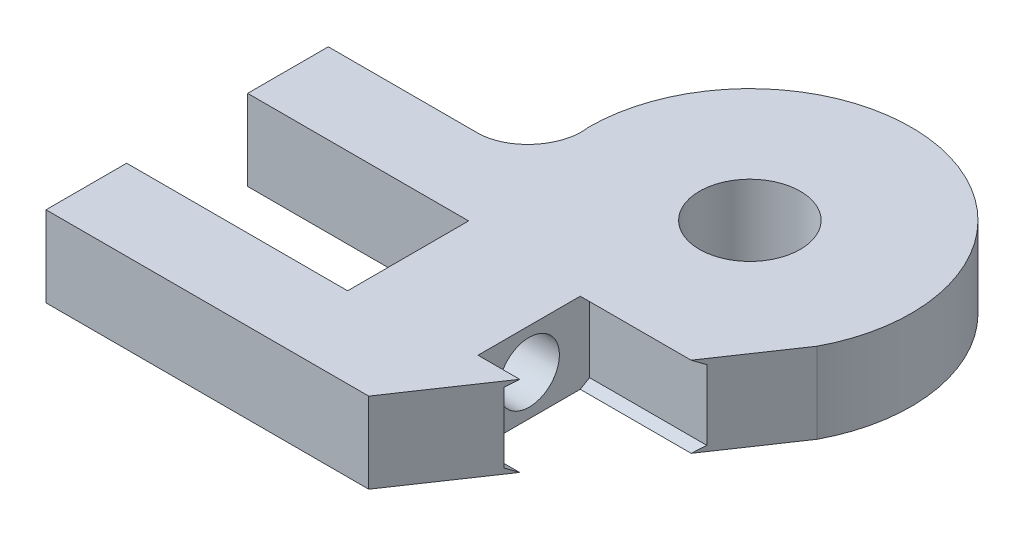
ISO-10303-21;
HEADER;
FILE_DESCRIPTION(('STEP AP214'),'2;1');
FILE_NAME('part.step','',(''),(''),'','','');
FILE_SCHEMA(('AUTOMOTIVE_DESIGN { 1 0 10303 214 1 1 1 1 }'));
ENDSEC;
DATA;
#1=APPLICATION_CONTEXT('core data for automotive mechanical design processes');
#2=APPLICATION_PROTOCOL_DEFINITION('international standard','automotive_design',2000,#1);
#3=PRODUCT_CONTEXT('',#1,'mechanical');
#4=PRODUCT('Part','Part','',(#3));
#5=PRODUCT_RELATED_PRODUCT_CATEGORY('part','',(#4));
#6=PRODUCT_DEFINITION_FORMATION('','',#4);
#7=PRODUCT_DEFINITION_CONTEXT('part definition',#1,'design');
#8=PRODUCT_DEFINITION('design','',#6,#7);
#9=PRODUCT_DEFINITION_SHAPE('','',#8);
#10=(LENGTH_UNIT() NAMED_UNIT(*) SI_UNIT(.MILLI.,.METRE.));
#11=(NAMED_UNIT(*) PLANE_ANGLE_UNIT() SI_UNIT($,.RADIAN.));
#12=(NAMED_UNIT(*) SI_UNIT($,.STERADIAN.) SOLID_ANGLE_UNIT());
#13=UNCERTAINTY_MEASURE_WITH_UNIT(LENGTH_MEASURE(1.E-05),#10,'distance_accuracy_value','');
#14=(GEOMETRIC_REPRESENTATION_CONTEXT(3) GLOBAL_UNCERTAINTY_ASSIGNED_CONTEXT((#13)) GLOBAL_UNIT_ASSIGNED_CONTEXT((#10,
#11,#12)) REPRESENTATION_CONTEXT('',''));
#15=CARTESIAN_POINT('',(0.,0.,0.));
#16=DIRECTION('',(0.,0.,1.));
#17=DIRECTION('',(1.,0.,0.));
#18=AXIS2_PLACEMENT_3D('',#15,#16,#17);
#19=CARTESIAN_POINT('',(7.09428135945336,4.,4.80069086107927));
#20=DIRECTION('',(-0.828195731701603,0.,-0.560438961878318));
#21=DIRECTION('',(-0.560438961878318,0.,0.828195731701603));
#22=AXIS2_PLACEMENT_3D('',#19,#20,#21);
#23=PLANE('',#22);
#24=DIRECTION('',(0.,1.,0.));
#25=VECTOR('',#24,1.);
#26=CARTESIAN_POINT('',(7.37140351893256,4.,4.39117010101042));
#27=LINE('',#26,#25);
#28=CARTESIAN_POINT('',(7.37140351893256,0.267949192431123,4.39117010101043));
#29=VERTEX_POINT('',#28);
#30=CARTESIAN_POINT('',(7.37140351893256,3.73205080756888,4.39117010101042));
#31=VERTEX_POINT('',#30);
#32=EDGE_CURVE('E11',#29,#31,#27,.T.);
#33=ORIENTED_EDGE('',*,*,#32,.T.);
#34=DIRECTION('',(0.505611207148687,0.431380721406754,-0.747173326882214));
#35=VECTOR('',#34,1.);
#36=CARTESIAN_POINT('',(7.20429348238066,3.58947475881277,4.63811906139843));
#37=LINE('',#36,#35);
#38=CARTESIAN_POINT('',(7.68546047121781,4.,3.92706848587267));
#39=VERTEX_POINT('',#38);
#40=EDGE_CURVE('E156',#31,#39,#37,.T.);
#41=ORIENTED_EDGE('',*,*,#40,.T.);
#42=DIRECTION('',(0.560438961878318,0.,-0.828195731701603));
#43=VECTOR('',#42,1.);
#44=CARTESIAN_POINT('',(7.09428135945336,4.,4.80069086107927));
#45=LINE('',#44,#43);
#46=CARTESIAN_POINT('',(4.6646087822495,4.,8.39117010101043));
#47=VERTEX_POINT('',#46);
#48=EDGE_CURVE('E135',#47,#39,#45,.T.);
#49=ORIENTED_EDGE('',*,*,#48,.F.);
#50=DIRECTION('',(0.,-1.,0.));
#51=VECTOR('',#50,1.);
#52=CARTESIAN_POINT('',(4.6646087822495,4.,8.39117010101043));
#53=LINE('',#52,#51);
#54=CARTESIAN_POINT('',(4.6646087822495,0.,8.39117010101043));
#55=VERTEX_POINT('',#54);
#56=EDGE_CURVE('E144',#47,#55,#53,.T.);
#57=ORIENTED_EDGE('',*,*,#56,.T.);
#58=DIRECTION('',(0.560438961878318,0.,-0.828195731701603));
#59=VECTOR('',#58,1.);
#60=CARTESIAN_POINT('',(7.09428135945336,0.,4.80069086107927));
#61=LINE('',#60,#59);
#62=CARTESIAN_POINT('',(7.68546047121781,0.,3.92706848587267));
#63=VERTEX_POINT('',#62);
#64=EDGE_CURVE('E188',#55,#63,#61,.T.);
#65=ORIENTED_EDGE('',*,*,#64,.T.);
#66=DIRECTION('',(-0.505611207148687,0.431380721406755,0.747173326882214));
#67=VECTOR('',#66,1.);
#68=CARTESIAN_POINT('',(6.3318497732161,1.15488254839288,5.92738373646376));
#69=LINE('',#68,#67);
#70=EDGE_CURVE('E282',#63,#29,#69,.T.);
#71=ORIENTED_EDGE('',*,*,#70,.T.);
#72=EDGE_LOOP('',(#33,#41,#49,#57,#65,#71));
#73=FACE_BOUND('',#72,.T.);
#74=ADVANCED_FACE('F37',(#73),#23,.F.);
#75=CARTESIAN_POINT('',(-3.91723550437462,4.,-5.60882989898957));
#76=CARTESIAN_POINT('',(-2.4076342223949,4.,-5.62724658271223));
#77=CARTESIAN_POINT('',(-1.19842789404271,4.,-7.12298520283082));
#78=CARTESIAN_POINT('',(-1.43410498266231,4.,-8.60882989898958));
#79=B_SPLINE_CURVE_WITH_KNOTS('',3,(#75,#76,#77,#78),.UNSPECIFIED.,.F.,.F.,(4,4),(0.,1.),.UNSPECIFIED.);
#80=DIRECTION('',(0.,-1.,0.));
#81=VECTOR('',#80,1.);
#82=SURFACE_OF_LINEAR_EXTRUSION('',#79,#81);
#83=CARTESIAN_POINT('',(-3.91723550437462,0.,-5.60882989898957));
#84=CARTESIAN_POINT('',(-2.4076342223949,0.,-5.62724658271223));
#85=CARTESIAN_POINT('',(-1.19842789404271,0.,-7.12298520283082));
#86=CARTESIAN_POINT('',(-1.43410498266231,0.,-8.60882989898958));
#87=B_SPLINE_CURVE_WITH_KNOTS('',3,(#83,#84,#85,#86),.UNSPECIFIED.,.F.,.F.,(4,4),(0.,1.),.UNSPECIFIED.);
#88=CARTESIAN_POINT('',(-3.91723550437462,0.,-5.60882989898957));
#89=VERTEX_POINT('',#88);
#90=CARTESIAN_POINT('',(-1.43410498266231,0.,-8.60882989898958));
#91=VERTEX_POINT('',#90);
#92=EDGE_CURVE('E164',#89,#91,#87,.T.);
#93=ORIENTED_EDGE('',*,*,#92,.F.);
#94=DIRECTION('',(0.,-1.,0.));
#95=VECTOR('',#94,1.);
#96=CARTESIAN_POINT('',(-3.91723550437462,4.,-5.60882989898957));
#97=LINE('',#96,#95);
#98=CARTESIAN_POINT('',(-3.91723550437462,4.,-5.60882989898957));
#99=VERTEX_POINT('',#98);
#100=EDGE_CURVE('E106',#99,#89,#97,.T.);
#101=ORIENTED_EDGE('',*,*,#100,.F.);
#102=CARTESIAN_POINT('',(-1.43410498266231,4.,-8.60882989898958));
#103=VERTEX_POINT('',#102);
#104=EDGE_CURVE('E195',#99,#103,#79,.T.);
#105=ORIENTED_EDGE('',*,*,#104,.T.);
#106=DIRECTION('',(0.,-1.,0.));
#107=VECTOR('',#106,1.);
#108=CARTESIAN_POINT('',(-1.43410498266231,4.,-8.60882989898958));
#109=LINE('',#108,#107);
#110=EDGE_CURVE('E101',#103,#91,#109,.T.);
#111=ORIENTED_EDGE('',*,*,#110,.T.);
#112=EDGE_LOOP('',(#93,#101,#105,#111));
#113=FACE_BOUND('',#112,.T.);
#114=ADVANCED_FACE('F39',(#113),#82,.T.);
#115=CARTESIAN_POINT('',(0.,4.,-5.60882989898957));
#116=DIRECTION('',(0.,0.,-1.));
#117=DIRECTION('',(-1.,0.,0.));
#118=AXIS2_PLACEMENT_3D('',#115,#116,#117);
#119=PLANE('',#118);
#120=DIRECTION('',(1.,0.,0.));
#121=VECTOR('',#120,1.);
#122=CARTESIAN_POINT('',(0.,0.,-5.60882989898957));
#123=LINE('',#122,#121);
#124=CARTESIAN_POINT('',(-11.3404612024368,0.,-5.60882989898957));
#125=VERTEX_POINT('',#124);
#126=EDGE_CURVE('E169',#125,#89,#123,.T.);
#127=ORIENTED_EDGE('',*,*,#126,.F.);
#128=DIRECTION('',(0.,-1.,0.));
#129=VECTOR('',#128,1.);
#130=CARTESIAN_POINT('',(-11.3404612024368,4.,-5.60882989898957));
#131=LINE('',#130,#129);
#132=CARTESIAN_POINT('',(-11.3404612024368,4.,-5.60882989898957));
#133=VERTEX_POINT('',#132);
#134=EDGE_CURVE('E212',#133,#125,#131,.T.);
#135=ORIENTED_EDGE('',*,*,#134,.F.);
#136=DIRECTION('',(1.,0.,0.));
#137=VECTOR('',#136,1.);
#138=CARTESIAN_POINT('',(0.,4.,-5.60882989898957));
#139=LINE('',#138,#137);
#140=EDGE_CURVE('E292',#133,#99,#139,.T.);
#141=ORIENTED_EDGE('',*,*,#140,.T.);
#142=ORIENTED_EDGE('',*,*,#100,.T.);
#143=EDGE_LOOP('',(#127,#135,#141,#142));
#144=FACE_BOUND('',#143,.T.);
#145=ADVANCED_FACE('F358',(#144),#119,.T.);
#146=CARTESIAN_POINT('',(-11.3404612024368,4.,0.));
#147=DIRECTION('',(1.,0.,0.));
#148=DIRECTION('',(0.,0.,-1.));
#149=AXIS2_PLACEMENT_3D('',#146,#147,#148);
#150=PLANE('',#149);
#151=DIRECTION('',(0.,0.,1.));
#152=VECTOR('',#151,1.);
#153=CARTESIAN_POINT('',(-11.3404612024368,0.,0.));
#154=LINE('',#153,#152);
#155=CARTESIAN_POINT('',(-11.3404612024368,0.,-1.60882989898957));
#156=VERTEX_POINT('',#155);
#157=EDGE_CURVE('E176',#125,#156,#154,.T.);
#158=ORIENTED_EDGE('',*,*,#157,.T.);
#159=DIRECTION('',(0.,-1.,0.));
#160=VECTOR('',#159,1.);
#161=CARTESIAN_POINT('',(-11.3404612024368,4.,-1.60882989898957));
#162=LINE('',#161,#160);
#163=CARTESIAN_POINT('',(-11.3404612024368,4.,-1.60882989898957));
#164=VERTEX_POINT('',#163);
#165=EDGE_CURVE('E209',#164,#156,#162,.T.);
#166=ORIENTED_EDGE('',*,*,#165,.F.);
#167=DIRECTION('',(0.,0.,1.));
#168=VECTOR('',#167,1.);
#169=CARTESIAN_POINT('',(-11.3404612024368,4.,0.));
#170=LINE('',#169,#168);
#171=EDGE_CURVE('E298',#133,#164,#170,.T.);
#172=ORIENTED_EDGE('',*,*,#171,.F.);
#173=ORIENTED_EDGE('',*,*,#134,.T.);
#174=EDGE_LOOP('',(#158,#166,#172,#173));
#175=FACE_BOUND('',#174,.T.);
#176=ADVANCED_FACE('F363',(#175),#150,.F.);
#177=CARTESIAN_POINT('',(0.,4.,-1.60882989898957));
#178=DIRECTION('',(0.,0.,-1.));
#179=DIRECTION('',(-1.,0.,0.));
#180=AXIS2_PLACEMENT_3D('',#177,#178,#179);
#181=PLANE('',#180);
#182=DIRECTION('',(1.,0.,0.));
#183=VECTOR('',#182,1.);
#184=CARTESIAN_POINT('',(0.,0.,-1.60882989898957));
#185=LINE('',#184,#183);
#186=CARTESIAN_POINT('',(-0.381690636444887,0.,-1.60882989898957));
#187=VERTEX_POINT('',#186);
#188=EDGE_CURVE('E178',#156,#187,#185,.T.);
#189=ORIENTED_EDGE('',*,*,#188,.T.);
#190=DIRECTION('',(0.,-1.,0.));
#191=VECTOR('',#190,1.);
#192=CARTESIAN_POINT('',(-0.381690636444887,4.,-1.60882989898957));
#193=LINE('',#192,#191);
#194=CARTESIAN_POINT('',(-0.381690636444887,4.,-1.60882989898957));
#195=VERTEX_POINT('',#194);
#196=EDGE_CURVE('E206',#195,#187,#193,.T.);
#197=ORIENTED_EDGE('',*,*,#196,.F.);
#198=DIRECTION('',(1.,0.,0.));
#199=VECTOR('',#198,1.);
#200=CARTESIAN_POINT('',(0.,4.,-1.60882989898957));
#201=LINE('',#200,#199);
#202=EDGE_CURVE('E300',#164,#195,#201,.T.);
#203=ORIENTED_EDGE('',*,*,#202,.F.);
#204=ORIENTED_EDGE('',*,*,#165,.T.);
#205=EDGE_LOOP('',(#189,#197,#203,#204));
#206=FACE_BOUND('',#205,.T.);
#207=ADVANCED_FACE('F367',(#206),#181,.F.);
#208=CARTESIAN_POINT('',(-0.381690636444887,4.,0.));
#209=DIRECTION('',(1.,0.,0.));
#210=DIRECTION('',(0.,0.,-1.));
#211=AXIS2_PLACEMENT_3D('',#208,#209,#210);
#212=PLANE('',#211);
#213=CARTESIAN_POINT('',(-0.381690636444887,2.,1.39117010101042));
#214=DIRECTION('',(1.,0.,0.));
#215=DIRECTION('',(0.,0.,-1.));
#216=AXIS2_PLACEMENT_3D('',#213,#214,#215);
#217=CIRCLE('',#216,1.5);
#218=CARTESIAN_POINT('',(-0.381690636444887,2.,-0.108829898989575));
#219=VERTEX_POINT('',#218);
#220=EDGE_CURVE('E170',#219,#219,#217,.T.);
#221=ORIENTED_EDGE('',*,*,#220,.T.);
#222=EDGE_LOOP('',(#221));
#223=FACE_BOUND('',#222,.T.);
#224=DIRECTION('',(0.,0.,1.));
#225=VECTOR('',#224,1.);
#226=CARTESIAN_POINT('',(-0.381690636444887,0.,0.));
#227=LINE('',#226,#225);
#228=CARTESIAN_POINT('',(-0.381690636444887,0.,4.39117010101043));
#229=VERTEX_POINT('',#228);
#230=EDGE_CURVE('E180',#187,#229,#227,.T.);
#231=ORIENTED_EDGE('',*,*,#230,.T.);
#232=DIRECTION('',(0.,-1.,0.));
#233=VECTOR('',#232,1.);
#234=CARTESIAN_POINT('',(-0.381690636444887,4.,4.39117010101043));
#235=LINE('',#234,#233);
#236=CARTESIAN_POINT('',(-0.381690636444887,4.,4.39117010101043));
#237=VERTEX_POINT('',#236);
#238=EDGE_CURVE('E203',#237,#229,#235,.T.);
#239=ORIENTED_EDGE('',*,*,#238,.F.);
#240=DIRECTION('',(0.,0.,1.));
#241=VECTOR('',#240,1.);
#242=CARTESIAN_POINT('',(-0.381690636444887,4.,0.));
#243=LINE('',#242,#241);
#244=EDGE_CURVE('E302',#195,#237,#243,.T.);
#245=ORIENTED_EDGE('',*,*,#244,.F.);
#246=ORIENTED_EDGE('',*,*,#196,.T.);
#247=EDGE_LOOP('',(#231,#239,#245,#246));
#248=FACE_BOUND('',#247,.T.);
#249=ADVANCED_FACE('F371',(#223,#248),#212,.F.);
#250=CARTESIAN_POINT('',(0.,4.,4.39117010101043));
#251=DIRECTION('',(0.,0.,1.));
#252=DIRECTION('',(1.,0.,0.));
#253=AXIS2_PLACEMENT_3D('',#250,#251,#252);
#254=PLANE('',#253);
#255=DIRECTION('',(-1.,0.,0.));
#256=VECTOR('',#255,1.);
#257=CARTESIAN_POINT('',(0.,0.,4.39117010101043));
#258=LINE('',#257,#256);
#259=CARTESIAN_POINT('',(-11.3404612024368,0.,4.39117010101043));
#260=VERTEX_POINT('',#259);
#261=EDGE_CURVE('E182',#229,#260,#258,.T.);
#262=ORIENTED_EDGE('',*,*,#261,.T.);
#263=DIRECTION('',(0.,-1.,0.));
#264=VECTOR('',#263,1.);
#265=CARTESIAN_POINT('',(-11.3404612024368,4.,4.39117010101043));
#266=LINE('',#265,#264);
#267=CARTESIAN_POINT('',(-11.3404612024368,4.,4.39117010101043));
#268=VERTEX_POINT('',#267);
#269=EDGE_CURVE('E200',#268,#260,#266,.T.);
#270=ORIENTED_EDGE('',*,*,#269,.F.);
#271=DIRECTION('',(-1.,0.,0.));
#272=VECTOR('',#271,1.);
#273=CARTESIAN_POINT('',(0.,4.,4.39117010101043));
#274=LINE('',#273,#272);
#275=EDGE_CURVE('E304',#237,#268,#274,.T.);
#276=ORIENTED_EDGE('',*,*,#275,.F.);
#277=ORIENTED_EDGE('',*,*,#238,.T.);
#278=EDGE_LOOP('',(#262,#270,#276,#277));
#279=FACE_BOUND('',#278,.T.);
#280=ADVANCED_FACE('F310',(#279),#254,.F.);
#281=CARTESIAN_POINT('',(-11.3404612024368,4.,0.));
#282=DIRECTION('',(1.,0.,0.));
#283=DIRECTION('',(0.,0.,-1.));
#284=AXIS2_PLACEMENT_3D('',#281,#282,#283);
#285=PLANE('',#284);
#286=DIRECTION('',(0.,0.,1.));
#287=VECTOR('',#286,1.);
#288=CARTESIAN_POINT('',(-11.3404612024368,0.,0.));
#289=LINE('',#288,#287);
#290=CARTESIAN_POINT('',(-11.3404612024368,0.,8.39117010101043));
#291=VERTEX_POINT('',#290);
#292=EDGE_CURVE('E184',#260,#291,#289,.T.);
#293=ORIENTED_EDGE('',*,*,#292,.T.);
#294=DIRECTION('',(0.,-1.,0.));
#295=VECTOR('',#294,1.);
#296=CARTESIAN_POINT('',(-11.3404612024368,4.,8.39117010101043));
#297=LINE('',#296,#295);
#298=CARTESIAN_POINT('',(-11.3404612024368,4.,8.39117010101043));
#299=VERTEX_POINT('',#298);
#300=EDGE_CURVE('E151',#299,#291,#297,.T.);
#301=ORIENTED_EDGE('',*,*,#300,.F.);
#302=DIRECTION('',(0.,0.,1.));
#303=VECTOR('',#302,1.);
#304=CARTESIAN_POINT('',(-11.3404612024368,4.,0.));
#305=LINE('',#304,#303);
#306=EDGE_CURVE('E137',#268,#299,#305,.T.);
#307=ORIENTED_EDGE('',*,*,#306,.F.);
#308=ORIENTED_EDGE('',*,*,#269,.T.);
#309=EDGE_LOOP('',(#293,#301,#307,#308));
#310=FACE_BOUND('',#309,.T.);
#311=ADVANCED_FACE('F314',(#310),#285,.F.);
#312=CARTESIAN_POINT('',(0.,4.,8.39117010101043));
#313=DIRECTION('',(0.,0.,-1.));
#314=DIRECTION('',(-1.,0.,0.));
#315=AXIS2_PLACEMENT_3D('',#312,#313,#314);
#316=PLANE('',#315);
#317=DIRECTION('',(1.,0.,0.));
#318=VECTOR('',#317,1.);
#319=CARTESIAN_POINT('',(0.,0.,8.39117010101043));
#320=LINE('',#319,#318);
#321=EDGE_CURVE('E147',#291,#55,#320,.T.);
#322=ORIENTED_EDGE('',*,*,#321,.T.);
#323=ORIENTED_EDGE('',*,*,#56,.F.);
#324=DIRECTION('',(1.,0.,0.));
#325=VECTOR('',#324,1.);
#326=CARTESIAN_POINT('',(0.,4.,8.39117010101043));
#327=LINE('',#326,#325);
#328=EDGE_CURVE('E129',#299,#47,#327,.T.);
#329=ORIENTED_EDGE('',*,*,#328,.F.);
#330=ORIENTED_EDGE('',*,*,#300,.T.);
#331=EDGE_LOOP('',(#322,#323,#329,#330));
#332=FACE_BOUND('',#331,.T.);
#333=ADVANCED_FACE('F145',(#332),#316,.F.);
#334=DIRECTION('',(0.,-1.,0.));
#335=VECTOR('',#334,1.);
#336=CARTESIAN_POINT('',(11.4315956239572,4.,-1.60882989898958));
#337=LINE('',#336,#335);
#338=CARTESIAN_POINT('',(11.4315956239572,3.73205080756887,-1.60882989898958));
#339=VERTEX_POINT('',#338);
#340=CARTESIAN_POINT('',(11.4315956239572,0.267949192431123,-1.60882989898958));
#341=VERTEX_POINT('',#340);
#342=EDGE_CURVE('E46',#339,#341,#337,.T.);
#343=ORIENTED_EDGE('',*,*,#342,.T.);
#344=DIRECTION('',(-0.505611207148687,-0.431380721406755,0.747173326882214));
#345=VECTOR('',#344,1.);
#346=CARTESIAN_POINT('',(8.71541031339753,-2.04946379639741,2.40504713978148));
#347=LINE('',#346,#345);
#348=CARTESIAN_POINT('',(11.1175386716719,0.,-1.14472828385182));
#349=VERTEX_POINT('',#348);
#350=EDGE_CURVE('E240',#341,#349,#347,.T.);
#351=ORIENTED_EDGE('',*,*,#350,.T.);
#352=CARTESIAN_POINT('',(13.6385765447403,0.,-4.87022374001289));
#353=VERTEX_POINT('',#352);
#354=EDGE_CURVE('E187',#349,#353,#61,.T.);
#355=ORIENTED_EDGE('',*,*,#354,.T.);
#356=DIRECTION('',(0.,-1.,0.));
#357=VECTOR('',#356,1.);
#358=CARTESIAN_POINT('',(13.6385765447403,4.,-4.87022374001289));
#359=LINE('',#358,#357);
#360=CARTESIAN_POINT('',(13.6385765447403,4.,-4.87022374001289));
#361=VERTEX_POINT('',#360);
#362=EDGE_CURVE('E152',#361,#353,#359,.T.);
#363=ORIENTED_EDGE('',*,*,#362,.F.);
#364=CARTESIAN_POINT('',(11.1175386716719,4.,-1.14472828385182));
#365=VERTEX_POINT('',#364);
#366=EDGE_CURVE('E141',#365,#361,#45,.T.);
#367=ORIENTED_EDGE('',*,*,#366,.F.);
#368=DIRECTION('',(0.505611207148687,-0.431380721406754,-0.747173326882214));
#369=VECTOR('',#368,1.);
#370=CARTESIAN_POINT('',(7.84296660423297,6.79382110360305,3.69431181484682));
#371=LINE('',#370,#369);
#372=EDGE_CURVE('E245',#365,#339,#371,.T.);
#373=ORIENTED_EDGE('',*,*,#372,.T.);
#374=EDGE_LOOP('',(#343,#351,#355,#363,#367,#373));
#375=FACE_BOUND('',#374,.T.);
#376=ADVANCED_FACE('F237',(#375),#23,.F.);
#377=CARTESIAN_POINT('',(6.56589501733769,4.,-8.60882989898958));
#378=DIRECTION('',(0.,-1.,0.));
#379=DIRECTION('',(0.,0.,-1.));
#380=AXIS2_PLACEMENT_3D('',#377,#378,#379);
#381=CYLINDRICAL_SURFACE('',#380,8.);
#382=CARTESIAN_POINT('',(6.56589501733769,0.,-8.60882989898958));
#383=DIRECTION('',(0.,1.,0.));
#384=DIRECTION('',(0.,0.,1.));
#385=AXIS2_PLACEMENT_3D('',#382,#383,#384);
#386=CIRCLE('',#385,8.);
#387=EDGE_CURVE('E190',#353,#91,#386,.T.);
#388=ORIENTED_EDGE('',*,*,#387,.T.);
#389=ORIENTED_EDGE('',*,*,#110,.F.);
#390=CARTESIAN_POINT('',(6.56589501733769,4.,-8.60882989898958));
#391=DIRECTION('',(0.,1.,0.));
#392=DIRECTION('',(0.,0.,1.));
#393=AXIS2_PLACEMENT_3D('',#390,#391,#392);
#394=CIRCLE('',#393,8.);
#395=EDGE_CURVE('E62',#361,#103,#394,.T.);
#396=ORIENTED_EDGE('',*,*,#395,.F.);
#397=ORIENTED_EDGE('',*,*,#362,.T.);
#398=EDGE_LOOP('',(#388,#389,#396,#397));
#399=FACE_BOUND('',#398,.T.);
#400=ADVANCED_FACE('F354',(#399),#381,.T.);
#401=CARTESIAN_POINT('',(6.56589501733769,4.,-8.60882989898958));
#402=DIRECTION('',(0.,-1.,0.));
#403=DIRECTION('',(0.,0.,-1.));
#404=AXIS2_PLACEMENT_3D('',#401,#402,#403);
#405=CYLINDRICAL_SURFACE('',#404,2.5);
#406=CARTESIAN_POINT('',(6.56589501733769,4.,-8.60882989898958));
#407=DIRECTION('',(0.,1.,0.));
#408=DIRECTION('',(0.,0.,1.));
#409=AXIS2_PLACEMENT_3D('',#406,#407,#408);
#410=CIRCLE('',#409,2.5);
#411=CARTESIAN_POINT('',(6.56589501733769,4.,-6.10882989898957));
#412=VERTEX_POINT('',#411);
#413=EDGE_CURVE('E158',#412,#412,#410,.T.);
#414=ORIENTED_EDGE('',*,*,#413,.T.);
#415=EDGE_LOOP('',(#414));
#416=FACE_BOUND('',#415,.T.);
#417=CARTESIAN_POINT('',(6.56589501733769,0.,-8.60882989898958));
#418=DIRECTION('',(0.,1.,0.));
#419=DIRECTION('',(0.,0.,1.));
#420=AXIS2_PLACEMENT_3D('',#417,#418,#419);
#421=CIRCLE('',#420,2.5);
#422=CARTESIAN_POINT('',(6.56589501733769,0.,-6.10882989898957));
#423=VERTEX_POINT('',#422);
#424=EDGE_CURVE('E192',#423,#423,#421,.T.);
#425=ORIENTED_EDGE('',*,*,#424,.F.);
#426=EDGE_LOOP('',(#425));
#427=FACE_BOUND('',#426,.T.);
#428=ADVANCED_FACE('F393',(#416,#427),#405,.F.);
#429=CARTESIAN_POINT('',(0.,4.,0.));
#430=DIRECTION('',(0.,1.,0.));
#431=DIRECTION('',(0.,0.,1.));
#432=AXIS2_PLACEMENT_3D('',#429,#430,#431);
#433=PLANE('',#432);
#434=DIRECTION('',(1.,0.,0.));
#435=VECTOR('',#434,1.);
#436=CARTESIAN_POINT('',(0.,4.,3.92706848587267));
#437=LINE('',#436,#435);
#438=CARTESIAN_POINT('',(5.61830936355511,4.,3.92706848587267));
#439=VERTEX_POINT('',#438);
#440=EDGE_CURVE('E229',#439,#39,#437,.T.);
#441=ORIENTED_EDGE('',*,*,#440,.F.);
#442=DIRECTION('',(0.,0.,1.));
#443=VECTOR('',#442,1.);
#444=CARTESIAN_POINT('',(5.61830936355511,4.,0.));
#445=LINE('',#444,#443);
#446=CARTESIAN_POINT('',(5.61830936355511,4.,-1.14472828385182));
#447=VERTEX_POINT('',#446);
#448=EDGE_CURVE('E278',#447,#439,#445,.T.);
#449=ORIENTED_EDGE('',*,*,#448,.F.);
#450=DIRECTION('',(-1.,0.,0.));
#451=VECTOR('',#450,1.);
#452=CARTESIAN_POINT('',(0.,4.,-1.14472828385182));
#453=LINE('',#452,#451);
#454=EDGE_CURVE('E226',#365,#447,#453,.T.);
#455=ORIENTED_EDGE('',*,*,#454,.F.);
#456=ORIENTED_EDGE('',*,*,#366,.T.);
#457=ORIENTED_EDGE('',*,*,#395,.T.);
#458=ORIENTED_EDGE('',*,*,#104,.F.);
#459=ORIENTED_EDGE('',*,*,#140,.F.);
#460=ORIENTED_EDGE('',*,*,#171,.T.);
#461=ORIENTED_EDGE('',*,*,#202,.T.);
#462=ORIENTED_EDGE('',*,*,#244,.T.);
#463=ORIENTED_EDGE('',*,*,#275,.T.);
#464=ORIENTED_EDGE('',*,*,#306,.T.);
#465=ORIENTED_EDGE('',*,*,#328,.T.);
#466=ORIENTED_EDGE('',*,*,#48,.T.);
#467=EDGE_LOOP('',(#441,#449,#455,#456,#457,#458,#459,#460,#461,#462,#463,#464,#465,#466));
#468=FACE_BOUND('',#467,.T.);
#469=ORIENTED_EDGE('',*,*,#413,.F.);
#470=EDGE_LOOP('',(#469));
#471=FACE_BOUND('',#470,.T.);
#472=ADVANCED_FACE('F132',(#468,#471),#433,.T.);
#473=CARTESIAN_POINT('',(0.,0.,0.));
#474=DIRECTION('',(0.,1.,0.));
#475=DIRECTION('',(0.,0.,1.));
#476=AXIS2_PLACEMENT_3D('',#473,#474,#475);
#477=PLANE('',#476);
#478=DIRECTION('',(0.,0.,1.));
#479=VECTOR('',#478,1.);
#480=CARTESIAN_POINT('',(5.61830936355511,0.,0.));
#481=LINE('',#480,#479);
#482=CARTESIAN_POINT('',(5.61830936355511,0.,-1.14472828385182));
#483=VERTEX_POINT('',#482);
#484=CARTESIAN_POINT('',(5.61830936355511,0.,3.92706848587267));
#485=VERTEX_POINT('',#484);
#486=EDGE_CURVE('E219',#483,#485,#481,.T.);
#487=ORIENTED_EDGE('',*,*,#486,.T.);
#488=DIRECTION('',(1.,0.,0.));
#489=VECTOR('',#488,1.);
#490=CARTESIAN_POINT('',(0.,0.,3.92706848587267));
#491=LINE('',#490,#489);
#492=EDGE_CURVE('E223',#485,#63,#491,.T.);
#493=ORIENTED_EDGE('',*,*,#492,.T.);
#494=ORIENTED_EDGE('',*,*,#64,.F.);
#495=ORIENTED_EDGE('',*,*,#321,.F.);
#496=ORIENTED_EDGE('',*,*,#292,.F.);
#497=ORIENTED_EDGE('',*,*,#261,.F.);
#498=ORIENTED_EDGE('',*,*,#230,.F.);
#499=ORIENTED_EDGE('',*,*,#188,.F.);
#500=ORIENTED_EDGE('',*,*,#157,.F.);
#501=ORIENTED_EDGE('',*,*,#126,.T.);
#502=ORIENTED_EDGE('',*,*,#92,.T.);
#503=ORIENTED_EDGE('',*,*,#387,.F.);
#504=ORIENTED_EDGE('',*,*,#354,.F.);
#505=DIRECTION('',(-1.,0.,0.));
#506=VECTOR('',#505,1.);
#507=CARTESIAN_POINT('',(0.,0.,-1.14472828385182));
#508=LINE('',#507,#506);
#509=EDGE_CURVE('E215',#349,#483,#508,.T.);
#510=ORIENTED_EDGE('',*,*,#509,.T.);
#511=EDGE_LOOP('',(#487,#493,#494,#495,#496,#497,#498,#499,#500,#501,#502,#503,#504,#510));
#512=FACE_BOUND('',#511,.T.);
#513=ORIENTED_EDGE('',*,*,#424,.T.);
#514=EDGE_LOOP('',(#513));
#515=FACE_BOUND('',#514,.T.);
#516=ADVANCED_FACE('F316',(#512,#515),#477,.F.);
#517=CARTESIAN_POINT('',(14.5658950173377,2.,1.39117010101042));
#518=DIRECTION('',(-1.,0.,0.));
#519=DIRECTION('',(0.,0.,1.));
#520=AXIS2_PLACEMENT_3D('',#517,#518,#519);
#521=CYLINDRICAL_SURFACE('',#520,1.5);
#522=CARTESIAN_POINT('',(5.61830936355511,2.,1.39117010101042));
#523=DIRECTION('',(-1.,0.,0.));
#524=DIRECTION('',(0.,0.,1.));
#525=AXIS2_PLACEMENT_3D('',#522,#523,#524);
#526=CIRCLE('',#525,1.5);
#527=CARTESIAN_POINT('',(5.61830936355511,2.,2.89117010101042));
#528=VERTEX_POINT('',#527);
#529=EDGE_CURVE('E216',#528,#528,#526,.F.);
#530=ORIENTED_EDGE('',*,*,#529,.T.);
#531=EDGE_LOOP('',(#530));
#532=FACE_BOUND('',#531,.T.);
#533=ORIENTED_EDGE('',*,*,#220,.F.);
#534=EDGE_LOOP('',(#533));
#535=FACE_BOUND('',#534,.T.);
#536=ADVANCED_FACE('F471',(#532,#535),#521,.F.);
#537=CARTESIAN_POINT('',(14.5658950173377,0.,4.39117010101042));
#538=DIRECTION('',(0.,0.,1.));
#539=DIRECTION('',(1.,0.,0.));
#540=AXIS2_PLACEMENT_3D('',#537,#538,#539);
#541=PLANE('',#540);
#542=DIRECTION('',(-1.,0.,0.));
#543=VECTOR('',#542,1.);
#544=CARTESIAN_POINT('',(14.5658950173377,0.267949192431124,4.39117010101042));
#545=LINE('',#544,#543);
#546=CARTESIAN_POINT('',(5.61830936355511,0.267949192431124,4.39117010101043));
#547=VERTEX_POINT('',#546);
#548=EDGE_CURVE('E270',#29,#547,#545,.T.);
#549=ORIENTED_EDGE('',*,*,#548,.T.);
#550=DIRECTION('',(0.,1.,0.));
#551=VECTOR('',#550,1.);
#552=CARTESIAN_POINT('',(5.61830936355511,0.,4.39117010101042));
#553=LINE('',#552,#551);
#554=CARTESIAN_POINT('',(5.61830936355511,3.73205080756888,4.39117010101042));
#555=VERTEX_POINT('',#554);
#556=EDGE_CURVE('E268',#547,#555,#553,.T.);
#557=ORIENTED_EDGE('',*,*,#556,.T.);
#558=DIRECTION('',(-1.,0.,0.));
#559=VECTOR('',#558,1.);
#560=CARTESIAN_POINT('',(14.5658950173377,3.73205080756888,4.39117010101042));
#561=LINE('',#560,#559);
#562=EDGE_CURVE('E220',#31,#555,#561,.T.);
#563=ORIENTED_EDGE('',*,*,#562,.F.);
#564=ORIENTED_EDGE('',*,*,#32,.F.);
#565=EDGE_LOOP('',(#549,#557,#563,#564));
#566=FACE_BOUND('',#565,.T.);
#567=ADVANCED_FACE('F479',(#566),#541,.F.);
#568=CARTESIAN_POINT('',(14.5658950173377,0.,-1.60882989898958));
#569=DIRECTION('',(0.,0.,-1.));
#570=DIRECTION('',(-1.,0.,0.));
#571=AXIS2_PLACEMENT_3D('',#568,#569,#570);
#572=PLANE('',#571);
#573=DIRECTION('',(-1.,0.,0.));
#574=VECTOR('',#573,1.);
#575=CARTESIAN_POINT('',(14.5658950173377,3.73205080756888,-1.60882989898958));
#576=LINE('',#575,#574);
#577=CARTESIAN_POINT('',(5.61830936355511,3.73205080756888,-1.60882989898958));
#578=VERTEX_POINT('',#577);
#579=EDGE_CURVE('E255',#339,#578,#576,.T.);
#580=ORIENTED_EDGE('',*,*,#579,.T.);
#581=DIRECTION('',(0.,-1.,0.));
#582=VECTOR('',#581,1.);
#583=CARTESIAN_POINT('',(5.61830936355511,0.,-1.60882989898958));
#584=LINE('',#583,#582);
#585=CARTESIAN_POINT('',(5.61830936355511,0.267949192431123,-1.60882989898958));
#586=VERTEX_POINT('',#585);
#587=EDGE_CURVE('E588',#578,#586,#584,.T.);
#588=ORIENTED_EDGE('',*,*,#587,.T.);
#589=DIRECTION('',(-1.,0.,0.));
#590=VECTOR('',#589,1.);
#591=CARTESIAN_POINT('',(14.5658950173377,0.267949192431123,-1.60882989898958));
#592=LINE('',#591,#590);
#593=EDGE_CURVE('E258',#341,#586,#592,.T.);
#594=ORIENTED_EDGE('',*,*,#593,.F.);
#595=ORIENTED_EDGE('',*,*,#342,.F.);
#596=EDGE_LOOP('',(#580,#588,#594,#595));
#597=FACE_BOUND('',#596,.T.);
#598=ADVANCED_FACE('F252',(#597),#572,.F.);
#599=CARTESIAN_POINT('',(14.5658950173377,4.70047053558351,2.71381792903704));
#600=DIRECTION('',(0.,0.866025403784439,0.5));
#601=DIRECTION('',(0.,-0.5,0.866025403784439));
#602=AXIS2_PLACEMENT_3D('',#599,#600,#601);
#603=PLANE('',#602);
#604=ORIENTED_EDGE('',*,*,#562,.T.);
#605=DIRECTION('',(0.,0.5,-0.866025403784439));
#606=VECTOR('',#605,1.);
#607=CARTESIAN_POINT('',(5.61830936355511,4.70047053558351,2.71381792903704));
#608=LINE('',#607,#606);
#609=EDGE_CURVE('E335',#555,#439,#608,.T.);
#610=ORIENTED_EDGE('',*,*,#609,.T.);
#611=ORIENTED_EDGE('',*,*,#440,.T.);
#612=ORIENTED_EDGE('',*,*,#40,.F.);
#613=EDGE_LOOP('',(#604,#610,#611,#612));
#614=FACE_BOUND('',#613,.T.);
#615=ADVANCED_FACE('F332',(#614),#603,.F.);
#616=CARTESIAN_POINT('',(14.5658950173377,3.49568188712312,-2.01823287853183));
#617=DIRECTION('',(0.,0.866025403784439,-0.5));
#618=DIRECTION('',(0.,0.5,0.866025403784439));
#619=AXIS2_PLACEMENT_3D('',#616,#617,#618);
#620=PLANE('',#619);
#621=ORIENTED_EDGE('',*,*,#454,.T.);
#622=DIRECTION('',(0.,-0.5,-0.866025403784439));
#623=VECTOR('',#622,1.);
#624=CARTESIAN_POINT('',(5.61830936355511,3.49568188712312,-2.01823287853183));
#625=LINE('',#624,#623);
#626=EDGE_CURVE('E266',#447,#578,#625,.T.);
#627=ORIENTED_EDGE('',*,*,#626,.T.);
#628=ORIENTED_EDGE('',*,*,#579,.F.);
#629=ORIENTED_EDGE('',*,*,#372,.F.);
#630=EDGE_LOOP('',(#621,#627,#628,#629));
#631=FACE_BOUND('',#630,.T.);
#632=ADVANCED_FACE('F263',(#631),#620,.F.);
#633=CARTESIAN_POINT('',(14.5658950173377,-1.70047053558351,0.981767121468166));
#634=DIRECTION('',(0.,-0.866025403784438,0.5));
#635=DIRECTION('',(0.,-0.5,-0.866025403784439));
#636=AXIS2_PLACEMENT_3D('',#633,#634,#635);
#637=PLANE('',#636);
#638=ORIENTED_EDGE('',*,*,#492,.F.);
#639=DIRECTION('',(0.,0.5,0.866025403784439));
#640=VECTOR('',#639,1.);
#641=CARTESIAN_POINT('',(5.61830936355511,-1.70047053558351,0.981767121468167));
#642=LINE('',#641,#640);
#643=EDGE_CURVE('E53',#485,#547,#642,.T.);
#644=ORIENTED_EDGE('',*,*,#643,.T.);
#645=ORIENTED_EDGE('',*,*,#548,.F.);
#646=ORIENTED_EDGE('',*,*,#70,.F.);
#647=EDGE_LOOP('',(#638,#644,#645,#646));
#648=FACE_BOUND('',#647,.T.);
#649=ADVANCED_FACE('F515',(#648),#637,.F.);
#650=CARTESIAN_POINT('',(14.5658950173377,-0.49568188712312,-0.286182070962957));
#651=DIRECTION('',(0.,-0.866025403784438,-0.5));
#652=DIRECTION('',(0.,0.5,-0.866025403784439));
#653=AXIS2_PLACEMENT_3D('',#650,#651,#652);
#654=PLANE('',#653);
#655=ORIENTED_EDGE('',*,*,#593,.T.);
#656=DIRECTION('',(0.,-0.5,0.866025403784439));
#657=VECTOR('',#656,1.);
#658=CARTESIAN_POINT('',(5.61830936355511,-0.49568188712312,-0.286182070962956));
#659=LINE('',#658,#657);
#660=EDGE_CURVE('E350',#586,#483,#659,.T.);
#661=ORIENTED_EDGE('',*,*,#660,.T.);
#662=ORIENTED_EDGE('',*,*,#509,.F.);
#663=ORIENTED_EDGE('',*,*,#350,.F.);
#664=EDGE_LOOP('',(#655,#661,#662,#663));
#665=FACE_BOUND('',#664,.T.);
#666=ADVANCED_FACE('F348',(#665),#654,.F.);
#667=CARTESIAN_POINT('',(5.61830936355511,0.,0.));
#668=DIRECTION('',(-1.,0.,0.));
#669=DIRECTION('',(0.,0.,1.));
#670=AXIS2_PLACEMENT_3D('',#667,#668,#669);
#671=PLANE('',#670);
#672=ORIENTED_EDGE('',*,*,#448,.T.);
#673=ORIENTED_EDGE('',*,*,#609,.F.);
#674=ORIENTED_EDGE('',*,*,#556,.F.);
#675=ORIENTED_EDGE('',*,*,#643,.F.);
#676=ORIENTED_EDGE('',*,*,#486,.F.);
#677=ORIENTED_EDGE('',*,*,#660,.F.);
#678=ORIENTED_EDGE('',*,*,#587,.F.);
#679=ORIENTED_EDGE('',*,*,#626,.F.);
#680=EDGE_LOOP('',(#672,#673,#674,#675,#676,#677,#678,#679));
#681=FACE_BOUND('',#680,.T.);
#682=ORIENTED_EDGE('',*,*,#529,.F.);
#683=EDGE_LOOP('',(#682));
#684=FACE_BOUND('',#683,.T.);
#685=ADVANCED_FACE('F532',(#681,#684),#671,.F.);
#686=CLOSED_SHELL('',(#74,#114,#145,#176,#207,#249,#280,#311,#333,#376,#400,#428,#472,#516,#536,
#567,#598,#615,#632,#649,#666,#685));
#687=MANIFOLD_SOLID_BREP('B2',#686);
#688=ADVANCED_BREP_SHAPE_REPRESENTATION('',(#18,#687),#14);
#689=SHAPE_DEFINITION_REPRESENTATION(#9,#688);
ENDSEC;
END-ISO-10303-21;
